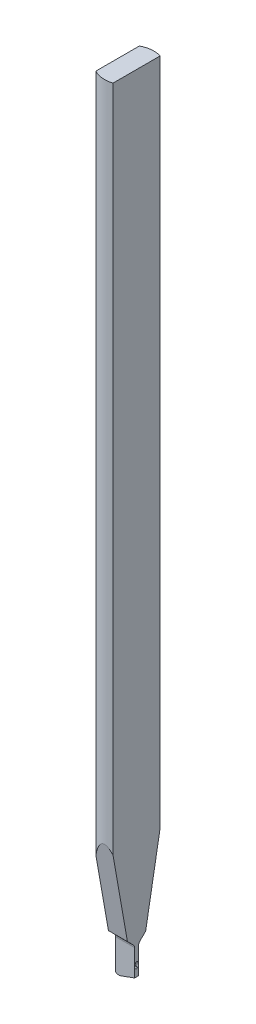
ISO-10303-21;
HEADER;
FILE_DESCRIPTION(('STEP AP214'),'2;1');
FILE_NAME('part.step','',(''),(''),'','','');
FILE_SCHEMA(('AUTOMOTIVE_DESIGN { 1 0 10303 214 1 1 1 1 }'));
ENDSEC;
DATA;
#1=APPLICATION_CONTEXT('core data for automotive mechanical design processes');
#2=APPLICATION_PROTOCOL_DEFINITION('international standard','automotive_design',2000,#1);
#3=PRODUCT_CONTEXT('',#1,'mechanical');
#4=PRODUCT('Part','Part','',(#3));
#5=PRODUCT_RELATED_PRODUCT_CATEGORY('part','',(#4));
#6=PRODUCT_DEFINITION_FORMATION('','',#4);
#7=PRODUCT_DEFINITION_CONTEXT('part definition',#1,'design');
#8=PRODUCT_DEFINITION('design','',#6,#7);
#9=PRODUCT_DEFINITION_SHAPE('','',#8);
#10=(LENGTH_UNIT() NAMED_UNIT(*) SI_UNIT(.MILLI.,.METRE.));
#11=(NAMED_UNIT(*) PLANE_ANGLE_UNIT() SI_UNIT($,.RADIAN.));
#12=(NAMED_UNIT(*) SI_UNIT($,.STERADIAN.) SOLID_ANGLE_UNIT());
#13=UNCERTAINTY_MEASURE_WITH_UNIT(LENGTH_MEASURE(1.E-05),#10,'distance_accuracy_value','');
#14=(GEOMETRIC_REPRESENTATION_CONTEXT(3) GLOBAL_UNCERTAINTY_ASSIGNED_CONTEXT((#13)) GLOBAL_UNIT_ASSIGNED_CONTEXT((#10,
#11,#12)) REPRESENTATION_CONTEXT('',''));
#15=CARTESIAN_POINT('',(0.,0.,0.));
#16=DIRECTION('',(0.,0.,1.));
#17=DIRECTION('',(1.,0.,0.));
#18=AXIS2_PLACEMENT_3D('',#15,#16,#17);
#19=CARTESIAN_POINT('',(32.315162028911,0.,-0.0635));
#20=DIRECTION('',(0.,0.,-1.));
#21=DIRECTION('',(-1.,0.,0.));
#22=AXIS2_PLACEMENT_3D('',#19,#20,#21);
#23=PLANE('',#22);
#24=DIRECTION('',(0.,1.,0.));
#25=VECTOR('',#24,1.);
#26=CARTESIAN_POINT('',(0.23368,0.,-0.0635));
#27=LINE('',#26,#25);
#28=CARTESIAN_POINT('',(0.23368,0.501535129884217,-0.0635));
#29=VERTEX_POINT('',#28);
#30=CARTESIAN_POINT('',(0.23368,1.016,-0.0635000000000001));
#31=VERTEX_POINT('',#30);
#32=EDGE_CURVE('E315',#29,#31,#27,.T.);
#33=ORIENTED_EDGE('',*,*,#32,.F.);
#34=CARTESIAN_POINT('',(0.23368,0.501535129884217,-0.0635));
#35=CARTESIAN_POINT('',(0.232967583186458,0.492128538234571,-0.0635));
#36=CARTESIAN_POINT('',(0.233679999999944,0.484736965625008,-0.0635));
#37=B_SPLINE_CURVE_WITH_KNOTS('',2,(#34,#35,#36),.UNSPECIFIED.,.F.,.F.,(3,3),(0.,1.),.UNSPECIFIED.);
#38=CARTESIAN_POINT('',(0.233679999999979,0.484736965625079,-0.0635));
#39=VERTEX_POINT('',#38);
#40=EDGE_CURVE('E60',#29,#39,#37,.T.);
#41=ORIENTED_EDGE('',*,*,#40,.T.);
#42=CARTESIAN_POINT('',(0.23368,0.171029613081689,-0.0635));
#43=VERTEX_POINT('',#42);
#44=EDGE_CURVE('E47',#43,#39,#27,.T.);
#45=ORIENTED_EDGE('',*,*,#44,.F.);
#46=DIRECTION('',(0.939692620785908,0.34202014332567,0.));
#47=VECTOR('',#46,1.);
#48=CARTESIAN_POINT('',(28.5073736740006,10.4618125231786,-0.0635));
#49=LINE('',#48,#47);
#50=CARTESIAN_POINT('',(-0.236219999999999,0.,-0.0635));
#51=VERTEX_POINT('',#50);
#52=EDGE_CURVE('E332',#51,#43,#49,.T.);
#53=ORIENTED_EDGE('',*,*,#52,.F.);
#54=DIRECTION('',(-1.,0.,0.));
#55=VECTOR('',#54,1.);
#56=CARTESIAN_POINT('',(32.315162028911,0.,-0.0635));
#57=LINE('',#56,#55);
#58=CARTESIAN_POINT('',(-0.32004,0.,-0.0635000000000011));
#59=VERTEX_POINT('',#58);
#60=EDGE_CURVE('E353',#51,#59,#57,.T.);
#61=ORIENTED_EDGE('',*,*,#60,.T.);
#62=CARTESIAN_POINT('',(-0.32004,0.05588,-0.0635000000000011));
#63=DIRECTION('',(0.,0.,-1.));
#64=DIRECTION('',(-1.,0.,0.));
#65=AXIS2_PLACEMENT_3D('',#62,#63,#64);
#66=CIRCLE('',#65,0.05588);
#67=CARTESIAN_POINT('',(-0.37592,0.05588,-0.0635000000000011));
#68=VERTEX_POINT('',#67);
#69=EDGE_CURVE('E472',#68,#59,#66,.F.);
#70=ORIENTED_EDGE('',*,*,#69,.F.);
#71=DIRECTION('',(0.,-1.,0.));
#72=VECTOR('',#71,1.);
#73=CARTESIAN_POINT('',(-0.37592,25.4,-0.0635));
#74=LINE('',#73,#72);
#75=CARTESIAN_POINT('',(-0.375920000000002,1.016,-0.0635000000000001));
#76=VERTEX_POINT('',#75);
#77=EDGE_CURVE('E389',#76,#68,#74,.T.);
#78=ORIENTED_EDGE('',*,*,#77,.F.);
#79=DIRECTION('',(-1.,0.,0.));
#80=VECTOR('',#79,1.);
#81=CARTESIAN_POINT('',(32.315162028911,1.016,-0.0635000000000001));
#82=LINE('',#81,#80);
#83=EDGE_CURVE('E340',#31,#76,#82,.T.);
#84=ORIENTED_EDGE('',*,*,#83,.F.);
#85=EDGE_LOOP('',(#33,#41,#45,#53,#61,#70,#78,#84));
#86=FACE_BOUND('',#85,.T.);
#87=ADVANCED_FACE('F43',(#86),#23,.T.);
#88=CARTESIAN_POINT('',(32.315162028911,0.,0.0635));
#89=DIRECTION('',(0.,0.,1.));
#90=DIRECTION('',(1.,0.,0.));
#91=AXIS2_PLACEMENT_3D('',#88,#89,#90);
#92=PLANE('',#91);
#93=DIRECTION('',(0.,-1.,0.));
#94=VECTOR('',#93,1.);
#95=CARTESIAN_POINT('',(0.23368,0.,0.0635));
#96=LINE('',#95,#94);
#97=CARTESIAN_POINT('',(0.233679999999121,0.484736965627162,0.0635));
#98=VERTEX_POINT('',#97);
#99=CARTESIAN_POINT('',(0.23368,0.171029613081689,0.0635));
#100=VERTEX_POINT('',#99);
#101=EDGE_CURVE('E443',#98,#100,#96,.T.);
#102=ORIENTED_EDGE('',*,*,#101,.F.);
#103=CARTESIAN_POINT('',(0.23368,0.48473696562502,0.0635));
#104=CARTESIAN_POINT('',(0.232967583185736,0.492128538242582,0.0635));
#105=CARTESIAN_POINT('',(0.233679999998765,0.50153512988423,0.0635));
#106=B_SPLINE_CURVE_WITH_KNOTS('',2,(#103,#104,#105),.UNSPECIFIED.,.F.,.F.,(3,3),(0.,1.),.UNSPECIFIED.);
#107=CARTESIAN_POINT('',(0.23368,0.501535129884217,0.0635));
#108=VERTEX_POINT('',#107);
#109=EDGE_CURVE('E504',#98,#108,#106,.T.);
#110=ORIENTED_EDGE('',*,*,#109,.T.);
#111=CARTESIAN_POINT('',(0.23368,1.016,0.0635));
#112=VERTEX_POINT('',#111);
#113=EDGE_CURVE('E484',#112,#108,#96,.T.);
#114=ORIENTED_EDGE('',*,*,#113,.F.);
#115=DIRECTION('',(-1.,0.,0.));
#116=VECTOR('',#115,1.);
#117=CARTESIAN_POINT('',(32.315162028911,1.016,0.0635));
#118=LINE('',#117,#116);
#119=CARTESIAN_POINT('',(-0.375920000000002,1.016,0.0635));
#120=VERTEX_POINT('',#119);
#121=EDGE_CURVE('E337',#112,#120,#118,.T.);
#122=ORIENTED_EDGE('',*,*,#121,.T.);
#123=DIRECTION('',(0.,1.,0.));
#124=VECTOR('',#123,1.);
#125=CARTESIAN_POINT('',(-0.37592,25.4,0.0635));
#126=LINE('',#125,#124);
#127=CARTESIAN_POINT('',(-0.37592,0.05588,0.0635000000000011));
#128=VERTEX_POINT('',#127);
#129=EDGE_CURVE('E387',#128,#120,#126,.T.);
#130=ORIENTED_EDGE('',*,*,#129,.F.);
#131=CARTESIAN_POINT('',(-0.32004,0.05588,0.0635000000000011));
#132=DIRECTION('',(0.,0.,1.));
#133=DIRECTION('',(1.,0.,0.));
#134=AXIS2_PLACEMENT_3D('',#131,#132,#133);
#135=CIRCLE('',#134,0.05588);
#136=CARTESIAN_POINT('',(-0.32004,0.,0.0635000000000011));
#137=VERTEX_POINT('',#136);
#138=EDGE_CURVE('E401',#137,#128,#135,.F.);
#139=ORIENTED_EDGE('',*,*,#138,.F.);
#140=DIRECTION('',(-1.,0.,0.));
#141=VECTOR('',#140,1.);
#142=CARTESIAN_POINT('',(32.315162028911,0.,0.0635));
#143=LINE('',#142,#141);
#144=CARTESIAN_POINT('',(-0.236219999999999,0.,0.0635));
#145=VERTEX_POINT('',#144);
#146=EDGE_CURVE('E350',#145,#137,#143,.T.);
#147=ORIENTED_EDGE('',*,*,#146,.F.);
#148=DIRECTION('',(-0.939692620785908,-0.34202014332567,0.));
#149=VECTOR('',#148,1.);
#150=CARTESIAN_POINT('',(28.5073736740006,10.4618125231786,0.0635));
#151=LINE('',#150,#149);
#152=EDGE_CURVE('E398',#100,#145,#151,.T.);
#153=ORIENTED_EDGE('',*,*,#152,.F.);
#154=EDGE_LOOP('',(#102,#110,#114,#122,#130,#139,#147,#153));
#155=FACE_BOUND('',#154,.T.);
#156=ADVANCED_FACE('F294',(#155),#92,.T.);
#157=CARTESIAN_POINT('',(0.23368,0.171029613081689,32.2105877496355));
#158=DIRECTION('',(-1.,0.,0.));
#159=DIRECTION('',(0.,-1.,0.));
#160=AXIS2_PLACEMENT_3D('',#157,#158,#159);
#161=PLANE('',#160);
#162=CARTESIAN_POINT('',(0.23368,0.493136047754618,0.));
#163=DIRECTION('',(-1.,0.,0.));
#164=DIRECTION('',(0.,1.,0.));
#165=AXIS2_PLACEMENT_3D('',#162,#163,#164);
#166=ELLIPSE('',#165,0.0990214987641499,0.0637296675187045);
#167=EDGE_CURVE('E11',#98,#39,#166,.F.);
#168=ORIENTED_EDGE('',*,*,#167,.F.);
#169=ORIENTED_EDGE('',*,*,#101,.T.);
#170=DIRECTION('',(0.,0.,-1.));
#171=VECTOR('',#170,1.);
#172=CARTESIAN_POINT('',(0.23368,0.171029613081689,32.2105877496355));
#173=LINE('',#172,#171);
#174=EDGE_CURVE('E468',#100,#43,#173,.T.);
#175=ORIENTED_EDGE('',*,*,#174,.T.);
#176=ORIENTED_EDGE('',*,*,#44,.T.);
#177=EDGE_LOOP('',(#168,#169,#175,#176));
#178=FACE_BOUND('',#177,.T.);
#179=ADVANCED_FACE('F300',(#178),#161,.F.);
#180=CARTESIAN_POINT('',(0.,0.,0.));
#181=DIRECTION('',(0.,1.,0.));
#182=DIRECTION('',(0.,0.,1.));
#183=AXIS2_PLACEMENT_3D('',#180,#181,#182);
#184=PLANE('',#183);
#185=DIRECTION('',(1.,0.,0.));
#186=VECTOR('',#185,1.);
#187=CARTESIAN_POINT('',(-0.375920000000002,0.,0.0254));
#188=LINE('',#187,#186);
#189=CARTESIAN_POINT('',(-0.32004,0.,0.0253999999999969));
#190=VERTEX_POINT('',#189);
#191=CARTESIAN_POINT('',(-0.24787716848564,0.,0.0254));
#192=VERTEX_POINT('',#191);
#193=EDGE_CURVE('E522',#190,#192,#188,.T.);
#194=ORIENTED_EDGE('',*,*,#193,.T.);
#195=CARTESIAN_POINT('',(-0.21508590948775,0.,0.));
#196=DIRECTION('',(0.,1.,0.));
#197=DIRECTION('',(-1.,0.,0.));
#198=AXIS2_PLACEMENT_3D('',#195,#196,#197);
#199=ELLIPSE('',#198,0.0439940905122496,0.0381);
#200=CARTESIAN_POINT('',(-0.23622,0.,0.0334159043520466));
#201=VERTEX_POINT('',#200);
#202=EDGE_CURVE('E257',#201,#192,#199,.F.);
#203=ORIENTED_EDGE('',*,*,#202,.F.);
#204=DIRECTION('',(0.,0.,-1.));
#205=VECTOR('',#204,1.);
#206=CARTESIAN_POINT('',(-0.23622,0.,32.2105877496355));
#207=LINE('',#206,#205);
#208=EDGE_CURVE('E444',#145,#201,#207,.T.);
#209=ORIENTED_EDGE('',*,*,#208,.F.);
#210=ORIENTED_EDGE('',*,*,#146,.T.);
#211=DIRECTION('',(0.,0.,-1.));
#212=VECTOR('',#211,1.);
#213=CARTESIAN_POINT('',(-0.32004,0.,31.9002533260299));
#214=LINE('',#213,#212);
#215=EDGE_CURVE('E515',#137,#190,#214,.T.);
#216=ORIENTED_EDGE('',*,*,#215,.T.);
#217=EDGE_LOOP('',(#194,#203,#209,#210,#216));
#218=FACE_BOUND('',#217,.T.);
#219=ADVANCED_FACE('F520',(#218),#184,.F.);
#220=CARTESIAN_POINT('',(-0.23622,0.,-0.0334159043520466));
#221=VERTEX_POINT('',#220);
#222=EDGE_CURVE('E467',#221,#51,#207,.T.);
#223=ORIENTED_EDGE('',*,*,#222,.F.);
#224=CARTESIAN_POINT('',(-0.24787716848564,0.,-0.0254));
#225=VERTEX_POINT('',#224);
#226=EDGE_CURVE('E255',#225,#221,#199,.F.);
#227=ORIENTED_EDGE('',*,*,#226,.F.);
#228=DIRECTION('',(1.,0.,0.));
#229=VECTOR('',#228,1.);
#230=CARTESIAN_POINT('',(-0.375920000000002,0.,-0.0254));
#231=LINE('',#230,#229);
#232=CARTESIAN_POINT('',(-0.32004,0.,-0.0254000000000038));
#233=VERTEX_POINT('',#232);
#234=EDGE_CURVE('E529',#233,#225,#231,.T.);
#235=ORIENTED_EDGE('',*,*,#234,.F.);
#236=EDGE_CURVE('E524',#233,#59,#214,.T.);
#237=ORIENTED_EDGE('',*,*,#236,.T.);
#238=ORIENTED_EDGE('',*,*,#60,.F.);
#239=EDGE_LOOP('',(#223,#227,#235,#237,#238));
#240=FACE_BOUND('',#239,.T.);
#241=ADVANCED_FACE('F551',(#240),#184,.F.);
#242=CARTESIAN_POINT('',(0.,25.4,0.));
#243=DIRECTION('',(0.,-1.,0.));
#244=DIRECTION('',(0.,0.,-1.));
#245=AXIS2_PLACEMENT_3D('',#242,#243,#244);
#246=CYLINDRICAL_SURFACE('',#245,0.792479999999998);
#247=CARTESIAN_POINT('',(0.,25.4,0.));
#248=DIRECTION('',(0.,1.,0.));
#249=DIRECTION('',(0.,0.,1.));
#250=AXIS2_PLACEMENT_3D('',#247,#248,#249);
#251=CIRCLE('',#250,0.792479999999998);
#252=CARTESIAN_POINT('',(0.233679999999999,25.4,-0.757243823348859));
#253=VERTEX_POINT('',#252);
#254=CARTESIAN_POINT('',(-0.37592,25.4,-0.69764511322018));
#255=VERTEX_POINT('',#254);
#256=EDGE_CURVE('E369',#253,#255,#251,.T.);
#257=ORIENTED_EDGE('',*,*,#256,.F.);
#258=DIRECTION('',(0.,-1.,0.));
#259=VECTOR('',#258,1.);
#260=CARTESIAN_POINT('',(0.233679999999999,25.4,-0.757243823348859));
#261=LINE('',#260,#259);
#262=CARTESIAN_POINT('',(0.23368,3.93441673283044,-0.757243823348858));
#263=VERTEX_POINT('',#262);
#264=EDGE_CURVE('E330',#253,#263,#261,.T.);
#265=ORIENTED_EDGE('',*,*,#264,.T.);
#266=CARTESIAN_POINT('',(0.,-0.360126395545723,0.));
#267=DIRECTION('',(0.,-0.173648177666931,-0.984807753012208));
#268=DIRECTION('',(0.,-0.984807753012208,0.173648177666931));
#269=AXIS2_PLACEMENT_3D('',#266,#267,#268);
#270=ELLIPSE('',#269,4.56371043248163,0.792479999999998);
#271=CARTESIAN_POINT('',(-0.37592,3.596415651605,-0.69764511322018));
#272=VERTEX_POINT('',#271);
#273=EDGE_CURVE('E358',#272,#263,#270,.T.);
#274=ORIENTED_EDGE('',*,*,#273,.F.);
#275=DIRECTION('',(0.,-1.,0.));
#276=VECTOR('',#275,1.);
#277=CARTESIAN_POINT('',(-0.37592,25.4,-0.69764511322018));
#278=LINE('',#277,#276);
#279=EDGE_CURVE('E366',#255,#272,#278,.T.);
#280=ORIENTED_EDGE('',*,*,#279,.F.);
#281=EDGE_LOOP('',(#257,#265,#274,#280));
#282=FACE_BOUND('',#281,.T.);
#283=ADVANCED_FACE('F583',(#282),#246,.T.);
#284=CARTESIAN_POINT('',(0.,25.4,0.));
#285=DIRECTION('',(0.,1.,0.));
#286=DIRECTION('',(0.,0.,1.));
#287=AXIS2_PLACEMENT_3D('',#284,#285,#286);
#288=PLANE('',#287);
#289=CARTESIAN_POINT('',(-0.37592,25.4,0.69764511322018));
#290=VERTEX_POINT('',#289);
#291=CARTESIAN_POINT('',(0.233679999999999,25.4,0.757243823348859));
#292=VERTEX_POINT('',#291);
#293=EDGE_CURVE('E370',#290,#292,#251,.T.);
#294=ORIENTED_EDGE('',*,*,#293,.T.);
#295=DIRECTION('',(0.,0.,-1.));
#296=VECTOR('',#295,1.);
#297=CARTESIAN_POINT('',(0.233679999999999,25.4,32.2105877496355));
#298=LINE('',#297,#296);
#299=EDGE_CURVE('E464',#292,#253,#298,.T.);
#300=ORIENTED_EDGE('',*,*,#299,.T.);
#301=ORIENTED_EDGE('',*,*,#256,.T.);
#302=DIRECTION('',(0.,0.,-1.));
#303=VECTOR('',#302,1.);
#304=CARTESIAN_POINT('',(-0.37592,25.4,-1.04648));
#305=LINE('',#304,#303);
#306=EDGE_CURVE('E361',#290,#255,#305,.T.);
#307=ORIENTED_EDGE('',*,*,#306,.F.);
#308=EDGE_LOOP('',(#294,#300,#301,#307));
#309=FACE_BOUND('',#308,.T.);
#310=ADVANCED_FACE('F463',(#309),#288,.T.);
#311=CARTESIAN_POINT('',(0.,-0.360126395545723,0.));
#312=DIRECTION('',(0.,-0.173648177666931,0.984807753012208));
#313=DIRECTION('',(0.,-0.984807753012208,-0.173648177666931));
#314=AXIS2_PLACEMENT_3D('',#311,#312,#313);
#315=ELLIPSE('',#314,4.56371043248163,0.792479999999998);
#316=CARTESIAN_POINT('',(0.23368,3.93441673283044,0.757243823348858));
#317=VERTEX_POINT('',#316);
#318=CARTESIAN_POINT('',(-0.37592,3.596415651605,0.69764511322018));
#319=VERTEX_POINT('',#318);
#320=EDGE_CURVE('E356',#317,#319,#315,.T.);
#321=ORIENTED_EDGE('',*,*,#320,.F.);
#322=DIRECTION('',(0.,-1.,0.));
#323=VECTOR('',#322,1.);
#324=CARTESIAN_POINT('',(0.233679999999999,25.4,0.757243823348859));
#325=LINE('',#324,#323);
#326=EDGE_CURVE('E460',#317,#292,#325,.F.);
#327=ORIENTED_EDGE('',*,*,#326,.T.);
#328=ORIENTED_EDGE('',*,*,#293,.F.);
#329=DIRECTION('',(0.,-1.,0.));
#330=VECTOR('',#329,1.);
#331=CARTESIAN_POINT('',(-0.37592,25.4,0.69764511322018));
#332=LINE('',#331,#330);
#333=EDGE_CURVE('E364',#319,#290,#332,.F.);
#334=ORIENTED_EDGE('',*,*,#333,.F.);
#335=EDGE_LOOP('',(#321,#327,#328,#334));
#336=FACE_BOUND('',#335,.T.);
#337=ADVANCED_FACE('F45',(#336),#246,.T.);
#338=CARTESIAN_POINT('',(-0.37592,25.4,-1.04648));
#339=DIRECTION('',(-1.,0.,0.));
#340=DIRECTION('',(0.,0.,1.));
#341=AXIS2_PLACEMENT_3D('',#338,#339,#340);
#342=PLANE('',#341);
#343=DIRECTION('',(0.,0.,-1.));
#344=VECTOR('',#343,1.);
#345=CARTESIAN_POINT('',(-0.37592,0.05588,31.9002533260299));
#346=LINE('',#345,#344);
#347=EDGE_CURVE('E527',#128,#68,#346,.T.);
#348=ORIENTED_EDGE('',*,*,#347,.F.);
#349=ORIENTED_EDGE('',*,*,#129,.T.);
#350=CARTESIAN_POINT('',(-0.375920000000002,1.016,0.1905));
#351=DIRECTION('',(-1.,0.,0.));
#352=DIRECTION('',(0.,0.,1.));
#353=AXIS2_PLACEMENT_3D('',#350,#351,#352);
#354=CIRCLE('',#353,0.127);
#355=CARTESIAN_POINT('',(-0.375920000000002,1.10580256121069,0.100697438789309));
#356=VERTEX_POINT('',#355);
#357=EDGE_CURVE('E384',#120,#356,#354,.F.);
#358=ORIENTED_EDGE('',*,*,#357,.T.);
#359=DIRECTION('',(0.,0.707106781186546,0.707106781186549));
#360=VECTOR('',#359,1.);
#361=CARTESIAN_POINT('',(-0.37592,12.6793125612106,11.6742074387893));
#362=LINE('',#361,#360);
#363=CARTESIAN_POINT('',(-0.375920000000002,1.29736569900095,0.292260576579566));
#364=VERTEX_POINT('',#363);
#365=EDGE_CURVE('E347',#356,#364,#362,.T.);
#366=ORIENTED_EDGE('',*,*,#365,.T.);
#367=DIRECTION('',(0.,0.984807753012208,0.173648177666931));
#368=VECTOR('',#367,1.);
#369=CARTESIAN_POINT('',(-0.37592,24.4442785246367,4.37368582784599));
#370=LINE('',#369,#368);
#371=EDGE_CURVE('E373',#364,#319,#370,.T.);
#372=ORIENTED_EDGE('',*,*,#371,.T.);
#373=ORIENTED_EDGE('',*,*,#333,.T.);
#374=ORIENTED_EDGE('',*,*,#306,.T.);
#375=ORIENTED_EDGE('',*,*,#279,.T.);
#376=DIRECTION('',(0.,-0.984807753012208,0.173648177666931));
#377=VECTOR('',#376,1.);
#378=CARTESIAN_POINT('',(-0.37592,24.8021957642242,-4.43679629404595));
#379=LINE('',#378,#377);
#380=CARTESIAN_POINT('',(-0.37592,1.29736569900094,-0.292260576579564));
#381=VERTEX_POINT('',#380);
#382=EDGE_CURVE('E376',#272,#381,#379,.T.);
#383=ORIENTED_EDGE('',*,*,#382,.T.);
#384=DIRECTION('',(0.,-0.707106781186546,0.707106781186549));
#385=VECTOR('',#384,1.);
#386=CARTESIAN_POINT('',(-0.37592,13.7257925612106,-12.7206874387893));
#387=LINE('',#386,#385);
#388=CARTESIAN_POINT('',(-0.375920000000002,1.10580256121069,-0.100697438789309));
#389=VERTEX_POINT('',#388);
#390=EDGE_CURVE('E344',#381,#389,#387,.T.);
#391=ORIENTED_EDGE('',*,*,#390,.T.);
#392=CARTESIAN_POINT('',(-0.375920000000002,1.016,-0.1905));
#393=DIRECTION('',(-1.,0.,0.));
#394=DIRECTION('',(0.,0.,1.));
#395=AXIS2_PLACEMENT_3D('',#392,#393,#394);
#396=CIRCLE('',#395,0.127);
#397=EDGE_CURVE('E392',#389,#76,#396,.F.);
#398=ORIENTED_EDGE('',*,*,#397,.T.);
#399=ORIENTED_EDGE('',*,*,#77,.T.);
#400=EDGE_LOOP('',(#348,#349,#358,#366,#372,#373,#374,#375,#383,#391,#398,#399));
#401=FACE_BOUND('',#400,.T.);
#402=ADVANCED_FACE('F456',(#401),#342,.T.);
#403=CARTESIAN_POINT('',(32.315162028911,0.,0.0635));
#404=DIRECTION('',(0.,-0.173648177666931,0.984807753012208));
#405=DIRECTION('',(0.,-0.984807753012208,-0.173648177666931));
#406=AXIS2_PLACEMENT_3D('',#403,#404,#405);
#407=PLANE('',#406);
#408=DIRECTION('',(0.,-0.984807753012208,-0.173648177666931));
#409=VECTOR('',#408,1.);
#410=CARTESIAN_POINT('',(0.23368,0.,0.0634999999999999));
#411=LINE('',#410,#409);
#412=CARTESIAN_POINT('',(0.23368,1.29736569900095,0.292260576579566));
#413=VERTEX_POINT('',#412);
#414=EDGE_CURVE('E448',#317,#413,#411,.T.);
#415=ORIENTED_EDGE('',*,*,#414,.F.);
#416=ORIENTED_EDGE('',*,*,#320,.T.);
#417=ORIENTED_EDGE('',*,*,#371,.F.);
#418=DIRECTION('',(1.,0.,0.));
#419=VECTOR('',#418,1.);
#420=CARTESIAN_POINT('',(32.315162028911,1.29736569900095,0.292260576579566));
#421=LINE('',#420,#419);
#422=EDGE_CURVE('E381',#364,#413,#421,.T.);
#423=ORIENTED_EDGE('',*,*,#422,.T.);
#424=EDGE_LOOP('',(#415,#416,#417,#423));
#425=FACE_BOUND('',#424,.T.);
#426=ADVANCED_FACE('F451',(#425),#407,.T.);
#427=CARTESIAN_POINT('',(32.315162028911,0.,-0.0635));
#428=DIRECTION('',(0.,-0.173648177666931,-0.984807753012208));
#429=DIRECTION('',(0.,0.984807753012208,-0.173648177666931));
#430=AXIS2_PLACEMENT_3D('',#427,#428,#429);
#431=PLANE('',#430);
#432=DIRECTION('',(0.,0.984807753012208,-0.173648177666931));
#433=VECTOR('',#432,1.);
#434=CARTESIAN_POINT('',(0.23368,0.,-0.0634999999999999));
#435=LINE('',#434,#433);
#436=CARTESIAN_POINT('',(0.23368,1.29736569900095,-0.292260576579566));
#437=VERTEX_POINT('',#436);
#438=EDGE_CURVE('E326',#437,#263,#435,.T.);
#439=ORIENTED_EDGE('',*,*,#438,.F.);
#440=DIRECTION('',(-1.,0.,0.));
#441=VECTOR('',#440,1.);
#442=CARTESIAN_POINT('',(32.315162028911,1.29736569900095,-0.292260576579566));
#443=LINE('',#442,#441);
#444=EDGE_CURVE('E379',#437,#381,#443,.T.);
#445=ORIENTED_EDGE('',*,*,#444,.T.);
#446=ORIENTED_EDGE('',*,*,#382,.F.);
#447=ORIENTED_EDGE('',*,*,#273,.T.);
#448=EDGE_LOOP('',(#439,#445,#446,#447));
#449=FACE_BOUND('',#448,.T.);
#450=ADVANCED_FACE('F579',(#449),#431,.T.);
#451=CARTESIAN_POINT('',(32.315162028911,1.10580256121069,-0.100697438789309));
#452=DIRECTION('',(0.,-0.707106781186549,-0.707106781186546));
#453=DIRECTION('',(0.,0.707106781186546,-0.707106781186549));
#454=AXIS2_PLACEMENT_3D('',#451,#452,#453);
#455=PLANE('',#454);
#456=DIRECTION('',(0.,0.707106781186546,-0.707106781186549));
#457=VECTOR('',#456,1.);
#458=CARTESIAN_POINT('',(0.23368,1.10580256121069,-0.100697438789308));
#459=LINE('',#458,#457);
#460=CARTESIAN_POINT('',(0.23368,1.10580256121069,-0.100697438789309));
#461=VERTEX_POINT('',#460);
#462=EDGE_CURVE('E321',#461,#437,#459,.T.);
#463=ORIENTED_EDGE('',*,*,#462,.F.);
#464=DIRECTION('',(-1.,0.,0.));
#465=VECTOR('',#464,1.);
#466=CARTESIAN_POINT('',(32.315162028911,1.10580256121069,-0.100697438789309));
#467=LINE('',#466,#465);
#468=EDGE_CURVE('E342',#461,#389,#467,.T.);
#469=ORIENTED_EDGE('',*,*,#468,.T.);
#470=ORIENTED_EDGE('',*,*,#390,.F.);
#471=ORIENTED_EDGE('',*,*,#444,.F.);
#472=EDGE_LOOP('',(#463,#469,#470,#471));
#473=FACE_BOUND('',#472,.T.);
#474=ADVANCED_FACE('F434',(#473),#455,.T.);
#475=CARTESIAN_POINT('',(32.315162028911,1.016,-0.1905));
#476=DIRECTION('',(-1.,0.,0.));
#477=DIRECTION('',(0.,0.,1.));
#478=AXIS2_PLACEMENT_3D('',#475,#476,#477);
#479=CYLINDRICAL_SURFACE('',#478,0.127);
#480=CARTESIAN_POINT('',(0.23368,1.016,-0.1905));
#481=DIRECTION('',(-1.,0.,0.));
#482=DIRECTION('',(0.,-1.,0.));
#483=AXIS2_PLACEMENT_3D('',#480,#481,#482);
#484=CIRCLE('',#483,0.127);
#485=EDGE_CURVE('E574',#31,#461,#484,.T.);
#486=ORIENTED_EDGE('',*,*,#485,.F.);
#487=ORIENTED_EDGE('',*,*,#83,.T.);
#488=ORIENTED_EDGE('',*,*,#397,.F.);
#489=ORIENTED_EDGE('',*,*,#468,.F.);
#490=EDGE_LOOP('',(#486,#487,#488,#489));
#491=FACE_BOUND('',#490,.T.);
#492=ADVANCED_FACE('F308',(#491),#479,.F.);
#493=CARTESIAN_POINT('',(32.315162028911,1.016,0.1905));
#494=DIRECTION('',(-1.,0.,0.));
#495=DIRECTION('',(0.,0.,1.));
#496=AXIS2_PLACEMENT_3D('',#493,#494,#495);
#497=CYLINDRICAL_SURFACE('',#496,0.127);
#498=CARTESIAN_POINT('',(0.23368,1.016,0.1905));
#499=DIRECTION('',(-1.,0.,0.));
#500=DIRECTION('',(0.,-1.,0.));
#501=AXIS2_PLACEMENT_3D('',#498,#499,#500);
#502=CIRCLE('',#501,0.127);
#503=CARTESIAN_POINT('',(0.23368,1.10580256121069,0.100697438789309));
#504=VERTEX_POINT('',#503);
#505=EDGE_CURVE('E439',#504,#112,#502,.T.);
#506=ORIENTED_EDGE('',*,*,#505,.F.);
#507=DIRECTION('',(-1.,0.,0.));
#508=VECTOR('',#507,1.);
#509=CARTESIAN_POINT('',(32.315162028911,1.10580256121069,0.100697438789309));
#510=LINE('',#509,#508);
#511=EDGE_CURVE('E335',#504,#356,#510,.T.);
#512=ORIENTED_EDGE('',*,*,#511,.T.);
#513=ORIENTED_EDGE('',*,*,#357,.F.);
#514=ORIENTED_EDGE('',*,*,#121,.F.);
#515=EDGE_LOOP('',(#506,#512,#513,#514));
#516=FACE_BOUND('',#515,.T.);
#517=ADVANCED_FACE('F427',(#516),#497,.F.);
#518=CARTESIAN_POINT('',(32.315162028911,1.10580256121069,0.100697438789309));
#519=DIRECTION('',(0.,-0.707106781186549,0.707106781186546));
#520=DIRECTION('',(0.,-0.707106781186546,-0.707106781186549));
#521=AXIS2_PLACEMENT_3D('',#518,#519,#520);
#522=PLANE('',#521);
#523=DIRECTION('',(0.,-0.707106781186546,-0.707106781186549));
#524=VECTOR('',#523,1.);
#525=CARTESIAN_POINT('',(0.23368,1.10580256121069,0.100697438789308));
#526=LINE('',#525,#524);
#527=EDGE_CURVE('E395',#413,#504,#526,.T.);
#528=ORIENTED_EDGE('',*,*,#527,.F.);
#529=ORIENTED_EDGE('',*,*,#422,.F.);
#530=ORIENTED_EDGE('',*,*,#365,.F.);
#531=ORIENTED_EDGE('',*,*,#511,.F.);
#532=EDGE_LOOP('',(#528,#529,#530,#531));
#533=FACE_BOUND('',#532,.T.);
#534=ADVANCED_FACE('F421',(#533),#522,.T.);
#535=EDGE_CURVE('E53',#29,#108,#166,.F.);
#536=ORIENTED_EDGE('',*,*,#535,.F.);
#537=ORIENTED_EDGE('',*,*,#32,.T.);
#538=ORIENTED_EDGE('',*,*,#485,.T.);
#539=ORIENTED_EDGE('',*,*,#462,.T.);
#540=ORIENTED_EDGE('',*,*,#438,.T.);
#541=ORIENTED_EDGE('',*,*,#264,.F.);
#542=ORIENTED_EDGE('',*,*,#299,.F.);
#543=ORIENTED_EDGE('',*,*,#326,.F.);
#544=ORIENTED_EDGE('',*,*,#414,.T.);
#545=ORIENTED_EDGE('',*,*,#527,.T.);
#546=ORIENTED_EDGE('',*,*,#505,.T.);
#547=ORIENTED_EDGE('',*,*,#113,.T.);
#548=EDGE_LOOP('',(#536,#537,#538,#539,#540,#541,#542,#543,#544,#545,#546,#547));
#549=FACE_BOUND('',#548,.T.);
#550=ADVANCED_FACE('F418',(#549),#161,.F.);
#551=CARTESIAN_POINT('',(-0.23622,0.,32.2105877496355));
#552=DIRECTION('',(-0.34202014332567,0.939692620785908,0.));
#553=DIRECTION('',(-0.939692620785908,-0.34202014332567,0.));
#554=AXIS2_PLACEMENT_3D('',#551,#552,#553);
#555=PLANE('',#554);
#556=ORIENTED_EDGE('',*,*,#208,.T.);
#557=CARTESIAN_POINT('',(-0.209463302146593,0.00973864158589462,0.));
#558=DIRECTION('',(-0.34202014332567,0.939692620785908,0.));
#559=DIRECTION('',(-0.939692620785908,-0.34202014332567,0.));
#560=AXIS2_PLACEMENT_3D('',#557,#558,#559);
#561=ELLIPSE('',#560,0.0592730778033821,0.0381);
#562=CARTESIAN_POINT('',(-0.209463302146593,0.00973864158589466,0.0380999999999996));
#563=VERTEX_POINT('',#562);
#564=EDGE_CURVE('E542',#201,#563,#561,.T.);
#565=ORIENTED_EDGE('',*,*,#564,.T.);
#566=DIRECTION('',(-0.939692620785908,-0.34202014332567,0.));
#567=VECTOR('',#566,1.);
#568=CARTESIAN_POINT('',(-0.23622,0.,0.0380999999999992));
#569=LINE('',#568,#567);
#570=CARTESIAN_POINT('',(-0.0457200000000001,0.0693363296277118,0.0380999999999996));
#571=VERTEX_POINT('',#570);
#572=EDGE_CURVE('E486',#571,#563,#569,.T.);
#573=ORIENTED_EDGE('',*,*,#572,.F.);
#574=DIRECTION('',(0.,0.,1.));
#575=VECTOR('',#574,1.);
#576=CARTESIAN_POINT('',(-0.0457200000000001,0.0693363296277117,32.2105877496355));
#577=LINE('',#576,#575);
#578=CARTESIAN_POINT('',(-0.0457200000000001,0.0693363296277118,-0.0380999999999996));
#579=VERTEX_POINT('',#578);
#580=EDGE_CURVE('E506',#579,#571,#577,.T.);
#581=ORIENTED_EDGE('',*,*,#580,.F.);
#582=DIRECTION('',(-0.939692620785908,-0.34202014332567,0.));
#583=VECTOR('',#582,1.);
#584=CARTESIAN_POINT('',(-0.23622,0.,-0.0380999999999992));
#585=LINE('',#584,#583);
#586=CARTESIAN_POINT('',(-0.209463302146593,0.0097386415858947,-0.0380999999999996));
#587=VERTEX_POINT('',#586);
#588=EDGE_CURVE('E220',#579,#587,#585,.T.);
#589=ORIENTED_EDGE('',*,*,#588,.T.);
#590=EDGE_CURVE('E489',#587,#221,#561,.T.);
#591=ORIENTED_EDGE('',*,*,#590,.T.);
#592=ORIENTED_EDGE('',*,*,#222,.T.);
#593=ORIENTED_EDGE('',*,*,#52,.T.);
#594=ORIENTED_EDGE('',*,*,#174,.F.);
#595=ORIENTED_EDGE('',*,*,#152,.T.);
#596=EDGE_LOOP('',(#556,#565,#573,#581,#589,#591,#592,#593,#594,#595));
#597=FACE_BOUND('',#596,.T.);
#598=ADVANCED_FACE('F289',(#597),#555,.F.);
#599=CARTESIAN_POINT('',(-0.32004,0.05588,31.9002533260299));
#600=DIRECTION('',(0.,0.,-1.));
#601=DIRECTION('',(-1.,0.,0.));
#602=AXIS2_PLACEMENT_3D('',#599,#600,#601);
#603=CYLINDRICAL_SURFACE('',#602,0.05588);
#604=CARTESIAN_POINT('',(-0.356477674367003,0.0135140905122495,-0.0175976362048998));
#605=CARTESIAN_POINT('',(-0.357376904480429,0.014285183702578,-0.0171534341812295));
#606=CARTESIAN_POINT('',(-0.358230956798375,0.0150716844925735,-0.0166307240525674));
#607=CARTESIAN_POINT('',(-0.359831358951498,0.0166317386558357,-0.0154137360035441));
#608=CARTESIAN_POINT('',(-0.360577085501932,0.0174051960873458,-0.0147185230734212));
#609=CARTESIAN_POINT('',(-0.361820165258227,0.0187625401140965,-0.0132774879923897));
#610=CARTESIAN_POINT('',(-0.362338199406546,0.019356549911165,-0.0125593583458686));
#611=CARTESIAN_POINT('',(-0.363268664201059,0.0204628270686732,-0.0110045616330548));
#612=CARTESIAN_POINT('',(-0.363681368248266,0.0209753047275703,-0.0101682103922115));
#613=CARTESIAN_POINT('',(-0.364397427656335,0.0218897784461368,-0.00838679036111317));
#614=CARTESIAN_POINT('',(-0.364700136661285,0.0222911182577069,-0.00744112066223241));
#615=CARTESIAN_POINT('',(-0.365188939094006,0.0229510080003233,-0.00547184429455359));
#616=CARTESIAN_POINT('',(-0.36537497511811,0.0232094876360648,-0.00444819953897178));
#617=CARTESIAN_POINT('',(-0.365617016357075,0.0235481441498642,-0.00245544642240648));
#618=CARTESIAN_POINT('',(-0.365683410143287,0.0236425375819324,-0.00148998532537641));
#619=CARTESIAN_POINT('',(-0.365718477016404,0.0236922303543137,0.000445937022448626));
#620=CARTESIAN_POINT('',(-0.365687200090857,0.0236476008461356,0.001416395461795));
#621=CARTESIAN_POINT('',(-0.365529848146696,0.0234259544927587,0.00330029743864325));
#622=CARTESIAN_POINT('',(-0.365407033139834,0.0232534914153485,0.00421455756607617));
#623=CARTESIAN_POINT('',(-0.365070995866995,0.0227912595553173,0.00599543091968617));
#624=CARTESIAN_POINT('',(-0.364857771125423,0.0225014875605601,0.00686204284042873));
#625=CARTESIAN_POINT('',(-0.364338129300942,0.0218148032561501,0.00854055190001651));
#626=CARTESIAN_POINT('',(-0.364030160539243,0.0214161204474461,0.00935123987843365));
#627=CARTESIAN_POINT('',(-0.363326225925753,0.0205360721958222,0.0108841065506175));
#628=CARTESIAN_POINT('',(-0.362930259371885,0.0200547060932323,0.0116062845381484));
#629=CARTESIAN_POINT('',(-0.362023972479575,0.018995838977666,0.0130023513458808));
#630=CARTESIAN_POINT('',(-0.361507371132423,0.0184138656995733,0.0136687478134871));
#631=CARTESIAN_POINT('',(-0.360389060494097,0.0172122449623864,0.0148858131893031));
#632=CARTESIAN_POINT('',(-0.359787265509873,0.016592559932719,0.0154363641693705));
#633=CARTESIAN_POINT('',(-0.358316867513414,0.0151510589954576,0.0165776295403988));
#634=CARTESIAN_POINT('',(-0.357422583341065,0.0143247329024897,0.0171302343644652));
#635=CARTESIAN_POINT('',(-0.356477674367768,0.0135140905123211,0.0175976362059765));
#636=B_SPLINE_CURVE_WITH_KNOTS('',3,(#604,#605,#606,#607,#608,#609,#610,#611,#612,#613,#614,
#615,#616,#617,#618,#619,#620,#621,#622,#623,#624,#625,#626,#627,#628,#629,#630,#631,#632,#633,
#634,#635),.UNSPECIFIED.,.F.,.F.,(4,2,2,2,2,2,2,2,2,2,2,2,2,2,2,4),(0.,0.00379999899087664,
0.00762106297348012,0.010806011876462,0.0139826076747904,0.0171775790252757,0.0203741210863205,
0.0232765697391288,0.026177533171838,0.0289798422844726,0.0317822281347288,0.0346332019685614,
0.0374841985493063,0.0405455123891615,0.0436099276612735,0.0476000736904468),.UNSPECIFIED.);
#637=CARTESIAN_POINT('',(-0.356477674367005,0.0135140905122495,-0.0175976362048998));
#638=VERTEX_POINT('',#637);
#639=CARTESIAN_POINT('',(-0.356477674367003,0.0135140905122495,0.0175976362048998));
#640=VERTEX_POINT('',#639);
#641=EDGE_CURVE('E407',#638,#640,#636,.T.);
#642=ORIENTED_EDGE('',*,*,#641,.T.);
#643=CARTESIAN_POINT('',(-0.32004,0.05588,-0.00686233304231926));
#644=DIRECTION('',(0.,0.499999999999998,0.86602540378444));
#645=DIRECTION('',(0.,0.86602540378444,-0.499999999999998));
#646=AXIS2_PLACEMENT_3D('',#643,#644,#645);
#647=ELLIPSE('',#646,0.0645246660846325,0.05588);
#648=EDGE_CURVE('E414',#640,#190,#647,.T.);
#649=ORIENTED_EDGE('',*,*,#648,.T.);
#650=ORIENTED_EDGE('',*,*,#215,.F.);
#651=ORIENTED_EDGE('',*,*,#138,.T.);
#652=ORIENTED_EDGE('',*,*,#347,.T.);
#653=ORIENTED_EDGE('',*,*,#69,.T.);
#654=ORIENTED_EDGE('',*,*,#236,.F.);
#655=CARTESIAN_POINT('',(-0.32004,0.05588,0.00686233304231232));
#656=DIRECTION('',(0.,0.499999999999998,-0.86602540378444));
#657=DIRECTION('',(0.,-0.86602540378444,-0.499999999999998));
#658=AXIS2_PLACEMENT_3D('',#655,#656,#657);
#659=ELLIPSE('',#658,0.0645246660846325,0.05588);
#660=EDGE_CURVE('E404',#233,#638,#659,.T.);
#661=ORIENTED_EDGE('',*,*,#660,.T.);
#662=EDGE_LOOP('',(#642,#649,#650,#651,#652,#653,#654,#661));
#663=FACE_BOUND('',#662,.T.);
#664=ADVANCED_FACE('F281',(#663),#603,.T.);
#665=CARTESIAN_POINT('',(-0.375920000000002,0.,0.0254));
#666=DIRECTION('',(0.,0.499999999999998,0.86602540378444));
#667=DIRECTION('',(0.,-0.86602540378444,0.499999999999998));
#668=AXIS2_PLACEMENT_3D('',#665,#666,#667);
#669=PLANE('',#668);
#670=DIRECTION('',(1.,0.,0.));
#671=VECTOR('',#670,1.);
#672=CARTESIAN_POINT('',(-0.375920000000002,0.0135140905122495,0.0175976362048998));
#673=LINE('',#672,#671);
#674=CARTESIAN_POINT('',(-0.246303766091918,0.013514090511837,0.017597636205138));
#675=VERTEX_POINT('',#674);
#676=EDGE_CURVE('E532',#640,#675,#673,.T.);
#677=ORIENTED_EDGE('',*,*,#676,.T.);
#678=CARTESIAN_POINT('',(-0.18968590948775,0.0439940905122497,0.));
#679=DIRECTION('',(0.,0.499999999999998,0.86602540378444));
#680=DIRECTION('',(-0.554700196225233,-0.720576692122891,0.416025147168919));
#681=AXIS2_PLACEMENT_3D('',#678,#679,#680);
#682=ELLIPSE('',#681,0.0879881810244995,0.0381);
#683=EDGE_CURVE('E265',#675,#192,#682,.T.);
#684=ORIENTED_EDGE('',*,*,#683,.T.);
#685=ORIENTED_EDGE('',*,*,#193,.F.);
#686=ORIENTED_EDGE('',*,*,#648,.F.);
#687=EDGE_LOOP('',(#677,#684,#685,#686));
#688=FACE_BOUND('',#687,.T.);
#689=ADVANCED_FACE('F279',(#688),#669,.F.);
#690=CARTESIAN_POINT('',(-0.375920000000002,0.00335409051224956,0.));
#691=DIRECTION('',(1.,0.,0.));
#692=DIRECTION('',(0.,0.,-1.));
#693=AXIS2_PLACEMENT_3D('',#690,#691,#692);
#694=CYLINDRICAL_SURFACE('',#693,0.02032);
#695=DIRECTION('',(1.,0.,0.));
#696=VECTOR('',#695,1.);
#697=CARTESIAN_POINT('',(-0.375920000000002,0.0135140905122495,-0.0175976362048998));
#698=LINE('',#697,#696);
#699=CARTESIAN_POINT('',(-0.246303766091823,0.0135140905122495,-0.0175976362048998));
#700=VERTEX_POINT('',#699);
#701=EDGE_CURVE('E534',#638,#700,#698,.T.);
#702=ORIENTED_EDGE('',*,*,#701,.T.);
#703=CARTESIAN_POINT('',(-0.246303766091823,0.0135140905122495,-0.0175976362048998));
#704=CARTESIAN_POINT('',(-0.24609019789227,0.0144400305134525,-0.0170648888113214));
#705=CARTESIAN_POINT('',(-0.245926018320623,0.0153292486061833,-0.0164524717356096));
#706=CARTESIAN_POINT('',(-0.245673788750918,0.0170037727844593,-0.015090788698178));
#707=CARTESIAN_POINT('',(-0.245585501265051,0.0177893964645279,-0.0143419585919797));
#708=CARTESIAN_POINT('',(-0.2454614190573,0.019231697390432,-0.012727154902474));
#709=CARTESIAN_POINT('',(-0.245425571281076,0.0198885043792228,-0.0118613006853603));
#710=CARTESIAN_POINT('',(-0.245383887824398,0.0210563666003219,-0.0100352437968069));
#711=CARTESIAN_POINT('',(-0.245378068349689,0.021567342989936,-0.00907499046462348));
#712=CARTESIAN_POINT('',(-0.245378799325917,0.0224453688209553,-0.00704900242970388));
#713=CARTESIAN_POINT('',(-0.245385807638859,0.022806503910111,-0.00598070081901989));
#714=CARTESIAN_POINT('',(-0.245399537257073,0.0233474018707641,-0.00379909460177225));
#715=CARTESIAN_POINT('',(-0.245406258538919,0.0235271499664218,-0.00268578633663459));
#716=CARTESIAN_POINT('',(-0.245412740738285,0.0237017050785637,-0.000426273074912246));
#717=CARTESIAN_POINT('',(-0.245412385634588,0.0236934290291388,0.000720171960588426));
#718=CARTESIAN_POINT('',(-0.245404735533222,0.0234845516831196,0.0029953244032182));
#719=CARTESIAN_POINT('',(-0.245397440708671,0.0232839551841546,0.00412403225210557));
#720=CARTESIAN_POINT('',(-0.245383664552057,0.0226962726268598,0.00633139438397766));
#721=CARTESIAN_POINT('',(-0.245377182946607,0.0223092494542574,0.00741006541104448));
#722=CARTESIAN_POINT('',(-0.245380016924591,0.0213593813930623,0.00948770807069159));
#723=CARTESIAN_POINT('',(-0.245389339395799,0.0207964599312366,0.0104866447545527));
#724=CARTESIAN_POINT('',(-0.245445314616565,0.0195127516133702,0.0123733717502294));
#725=CARTESIAN_POINT('',(-0.245491895813931,0.018792269264629,0.0132613713316833));
#726=CARTESIAN_POINT('',(-0.245648866291787,0.0172166172213964,0.0149002742614693));
#727=CARTESIAN_POINT('',(-0.245759118632835,0.016361739437945,0.0156514672972808));
#728=CARTESIAN_POINT('',(-0.245967818074452,0.0151439856421801,0.0165545749914788));
#729=CARTESIAN_POINT('',(-0.246026822229853,0.014825017925967,0.0167771005047926));
#730=CARTESIAN_POINT('',(-0.246156394692418,0.0141769109653905,0.0172022815880497));
#731=CARTESIAN_POINT('',(-0.246226949587854,0.0138477838726696,0.0174049597719126));
#732=CARTESIAN_POINT('',(-0.246303766092064,0.0135140905118664,0.0175976362051437));
#733=B_SPLINE_CURVE_WITH_KNOTS('',3,(#703,#704,#705,#706,#707,#708,#709,#710,#711,#712,#713,
#714,#715,#716,#717,#718,#719,#720,#721,#722,#723,#724,#725,#726,#727,#728,#729,#730,#731,#732),
.UNSPECIFIED.,.F.,.F.,(4,2,2,2,2,2,2,2,2,2,2,2,2,2,4),(0.,0.00326107463651061,
0.00651190690659179,0.00975944796227405,0.0130087414754843,0.0163762803545564,
0.0197440935322325,0.023167168620162,0.0265901583182232,0.0300119941759454,0.0334353217305679,
0.0368520908166597,0.0402615385780514,0.0414410302948985,0.0426191620759432),.UNSPECIFIED.);
#734=EDGE_CURVE('E69',#700,#675,#733,.T.);
#735=ORIENTED_EDGE('',*,*,#734,.T.);
#736=ORIENTED_EDGE('',*,*,#676,.F.);
#737=ORIENTED_EDGE('',*,*,#641,.F.);
#738=EDGE_LOOP('',(#702,#735,#736,#737));
#739=FACE_BOUND('',#738,.T.);
#740=ADVANCED_FACE('F267',(#739),#694,.F.);
#741=CARTESIAN_POINT('',(-0.375920000000002,0.0135140905122495,-0.0175976362048998));
#742=DIRECTION('',(0.,0.499999999999998,-0.86602540378444));
#743=DIRECTION('',(0.,0.86602540378444,0.499999999999998));
#744=AXIS2_PLACEMENT_3D('',#741,#742,#743);
#745=PLANE('',#744);
#746=ORIENTED_EDGE('',*,*,#234,.T.);
#747=CARTESIAN_POINT('',(-0.18968590948775,0.0439940905122497,0.));
#748=DIRECTION('',(0.,0.499999999999998,-0.86602540378444));
#749=DIRECTION('',(-0.554700196225232,-0.720576692122891,-0.416025147168919));
#750=AXIS2_PLACEMENT_3D('',#747,#748,#749);
#751=ELLIPSE('',#750,0.0879881810244996,0.0381);
#752=EDGE_CURVE('E508',#225,#700,#751,.T.);
#753=ORIENTED_EDGE('',*,*,#752,.T.);
#754=ORIENTED_EDGE('',*,*,#701,.F.);
#755=ORIENTED_EDGE('',*,*,#660,.F.);
#756=EDGE_LOOP('',(#746,#753,#754,#755));
#757=FACE_BOUND('',#756,.T.);
#758=ADVANCED_FACE('F287',(#757),#745,.F.);
#759=CARTESIAN_POINT('',(0.199699269599057,0.418139269599054,0.));
#760=DIRECTION('',(0.707106781186551,0.707106781186544,0.));
#761=DIRECTION('',(-0.707106781186544,0.707106781186551,0.));
#762=AXIS2_PLACEMENT_3D('',#759,#760,#761);
#763=CONICAL_SURFACE('',#762,0.0381,0.392699081698725);
#764=CARTESIAN_POINT('',(0.199699269599057,0.418139269599054,0.));
#765=DIRECTION('',(0.707106781186551,0.707106781186544,0.));
#766=DIRECTION('',(-0.707106781186544,0.707106781186551,0.));
#767=AXIS2_PLACEMENT_3D('',#764,#765,#766);
#768=CIRCLE('',#767,0.0381);
#769=CARTESIAN_POINT('',(0.172758501235849,0.445080037962262,0.));
#770=VERTEX_POINT('',#769);
#771=EDGE_CURVE('E240',#770,#770,#768,.T.);
#772=ORIENTED_EDGE('',*,*,#771,.F.);
#773=EDGE_LOOP('',(#772));
#774=FACE_BOUND('',#773,.T.);
#775=ORIENTED_EDGE('',*,*,#167,.T.);
#776=ORIENTED_EDGE('',*,*,#40,.F.);
#777=ORIENTED_EDGE('',*,*,#535,.T.);
#778=ORIENTED_EDGE('',*,*,#109,.F.);
#779=EDGE_LOOP('',(#775,#776,#777,#778));
#780=FACE_BOUND('',#779,.T.);
#781=ADVANCED_FACE('F560',(#774,#780),#763,.F.);
#782=CARTESIAN_POINT('',(-0.0457200000000001,0.17272,0.0381));
#783=DIRECTION('',(-1.,0.,0.));
#784=DIRECTION('',(0.,0.,1.));
#785=AXIS2_PLACEMENT_3D('',#782,#783,#784);
#786=PLANE('',#785);
#787=ORIENTED_EDGE('',*,*,#580,.T.);
#788=DIRECTION('',(0.,1.,0.));
#789=VECTOR('',#788,1.);
#790=CARTESIAN_POINT('',(-0.0457200000000001,0.17272,0.0381));
#791=LINE('',#790,#789);
#792=CARTESIAN_POINT('',(-0.0457200000000001,0.17272,0.0381));
#793=VERTEX_POINT('',#792);
#794=EDGE_CURVE('E230',#571,#793,#791,.T.);
#795=ORIENTED_EDGE('',*,*,#794,.T.);
#796=CARTESIAN_POINT('',(-0.0457200000000001,0.17272,0.));
#797=DIRECTION('',(1.,0.,0.));
#798=DIRECTION('',(0.,1.,0.));
#799=AXIS2_PLACEMENT_3D('',#796,#797,#798);
#800=ELLIPSE('',#799,0.0538815367264146,0.0381);
#801=CARTESIAN_POINT('',(-0.0457200000000001,0.17272,-0.0380999999999992));
#802=VERTEX_POINT('',#801);
#803=EDGE_CURVE('E226',#802,#793,#800,.F.);
#804=ORIENTED_EDGE('',*,*,#803,.F.);
#805=DIRECTION('',(0.,1.,0.));
#806=VECTOR('',#805,1.);
#807=CARTESIAN_POINT('',(-0.0457200000000001,0.17272,-0.0381));
#808=LINE('',#807,#806);
#809=EDGE_CURVE('E213',#579,#802,#808,.T.);
#810=ORIENTED_EDGE('',*,*,#809,.F.);
#811=EDGE_LOOP('',(#787,#795,#804,#810));
#812=FACE_BOUND('',#811,.T.);
#813=ADVANCED_FACE('F228',(#812),#786,.T.);
#814=CARTESIAN_POINT('',(0.,0.,0.0381));
#815=DIRECTION('',(0.,0.,-1.));
#816=DIRECTION('',(-1.,0.,0.));
#817=AXIS2_PLACEMENT_3D('',#814,#815,#816);
#818=PLANE('',#817);
#819=ORIENTED_EDGE('',*,*,#572,.T.);
#820=DIRECTION('',(-0.500000000000004,-0.866025403784436,0.));
#821=VECTOR('',#820,1.);
#822=CARTESIAN_POINT('',(-0.161314432115812,0.0931349308062367,0.0381));
#823=LINE('',#822,#821);
#824=CARTESIAN_POINT('',(-0.115365970993317,0.17272,0.0381));
#825=VERTEX_POINT('',#824);
#826=EDGE_CURVE('E249',#825,#563,#823,.T.);
#827=ORIENTED_EDGE('',*,*,#826,.F.);
#828=DIRECTION('',(-1.,0.,0.));
#829=VECTOR('',#828,1.);
#830=CARTESIAN_POINT('',(-0.159360061505567,0.17272,0.0381));
#831=LINE('',#830,#829);
#832=EDGE_CURVE('E223',#793,#825,#831,.T.);
#833=ORIENTED_EDGE('',*,*,#832,.F.);
#834=ORIENTED_EDGE('',*,*,#794,.F.);
#835=EDGE_LOOP('',(#819,#827,#833,#834));
#836=FACE_BOUND('',#835,.T.);
#837=ADVANCED_FACE('F554',(#836),#818,.T.);
#838=CARTESIAN_POINT('',(0.,0.,-0.0381));
#839=DIRECTION('',(0.,0.,-1.));
#840=DIRECTION('',(-1.,0.,0.));
#841=AXIS2_PLACEMENT_3D('',#838,#839,#840);
#842=PLANE('',#841);
#843=ORIENTED_EDGE('',*,*,#809,.T.);
#844=DIRECTION('',(-1.,0.,0.));
#845=VECTOR('',#844,1.);
#846=CARTESIAN_POINT('',(-0.159360061505567,0.17272,-0.0381));
#847=LINE('',#846,#845);
#848=CARTESIAN_POINT('',(-0.115365970993317,0.17272,-0.0381));
#849=VERTEX_POINT('',#848);
#850=EDGE_CURVE('E218',#802,#849,#847,.T.);
#851=ORIENTED_EDGE('',*,*,#850,.T.);
#852=DIRECTION('',(0.500000000000004,0.866025403784436,0.));
#853=VECTOR('',#852,1.);
#854=CARTESIAN_POINT('',(-0.115365970993317,0.17272,-0.0381));
#855=LINE('',#854,#853);
#856=EDGE_CURVE('E252',#587,#849,#855,.T.);
#857=ORIENTED_EDGE('',*,*,#856,.F.);
#858=ORIENTED_EDGE('',*,*,#588,.F.);
#859=EDGE_LOOP('',(#843,#851,#857,#858));
#860=FACE_BOUND('',#859,.T.);
#861=ADVANCED_FACE('F215',(#860),#842,.F.);
#862=CARTESIAN_POINT('',(-0.115365970993317,0.17272,0.));
#863=DIRECTION('',(-0.500000000000004,-0.866025403784436,0.));
#864=DIRECTION('',(0.866025403784436,-0.500000000000004,0.));
#865=AXIS2_PLACEMENT_3D('',#862,#863,#864);
#866=CYLINDRICAL_SURFACE('',#865,0.0381);
#867=ORIENTED_EDGE('',*,*,#202,.T.);
#868=ORIENTED_EDGE('',*,*,#683,.F.);
#869=ORIENTED_EDGE('',*,*,#734,.F.);
#870=ORIENTED_EDGE('',*,*,#752,.F.);
#871=ORIENTED_EDGE('',*,*,#226,.T.);
#872=ORIENTED_EDGE('',*,*,#590,.F.);
#873=ORIENTED_EDGE('',*,*,#856,.T.);
#874=CARTESIAN_POINT('',(-0.115365970993317,0.17272,0.));
#875=DIRECTION('',(0.,-1.,0.));
#876=DIRECTION('',(-1.,0.,0.));
#877=AXIS2_PLACEMENT_3D('',#874,#875,#876);
#878=ELLIPSE('',#877,0.0439940905122496,0.0381);
#879=EDGE_CURVE('E244',#849,#825,#878,.F.);
#880=ORIENTED_EDGE('',*,*,#879,.T.);
#881=ORIENTED_EDGE('',*,*,#826,.T.);
#882=ORIENTED_EDGE('',*,*,#564,.F.);
#883=EDGE_LOOP('',(#867,#868,#869,#870,#871,#872,#873,#880,#881,#882));
#884=FACE_BOUND('',#883,.T.);
#885=ADVANCED_FACE('F272',(#884),#866,.F.);
#886=CARTESIAN_POINT('',(-0.159360061505567,0.17272,0.0381));
#887=DIRECTION('',(0.,-1.,0.));
#888=DIRECTION('',(0.,0.,-1.));
#889=AXIS2_PLACEMENT_3D('',#886,#887,#888);
#890=PLANE('',#889);
#891=ORIENTED_EDGE('',*,*,#850,.F.);
#892=CARTESIAN_POINT('',(-0.04572,0.17272,0.));
#893=DIRECTION('',(0.,1.,0.));
#894=DIRECTION('',(1.,0.,0.));
#895=AXIS2_PLACEMENT_3D('',#892,#893,#894);
#896=ELLIPSE('',#895,0.0538815367264151,0.0381);
#897=EDGE_CURVE('E234',#793,#802,#896,.F.);
#898=ORIENTED_EDGE('',*,*,#897,.F.);
#899=ORIENTED_EDGE('',*,*,#832,.T.);
#900=ORIENTED_EDGE('',*,*,#879,.F.);
#901=EDGE_LOOP('',(#891,#898,#899,#900));
#902=FACE_BOUND('',#901,.T.);
#903=ADVANCED_FACE('F243',(#902),#890,.T.);
#904=CARTESIAN_POINT('',(-0.310421536726417,-0.0919815367264147,0.));
#905=DIRECTION('',(0.707106781186551,0.707106781186544,0.));
#906=DIRECTION('',(-0.707106781186544,0.707106781186551,0.));
#907=AXIS2_PLACEMENT_3D('',#904,#905,#906);
#908=CYLINDRICAL_SURFACE('',#907,0.0381);
#909=ORIENTED_EDGE('',*,*,#803,.T.);
#910=ORIENTED_EDGE('',*,*,#897,.T.);
#911=EDGE_LOOP('',(#909,#910));
#912=FACE_BOUND('',#911,.T.);
#913=ORIENTED_EDGE('',*,*,#771,.T.);
#914=EDGE_LOOP('',(#913));
#915=FACE_BOUND('',#914,.T.);
#916=ADVANCED_FACE('F236',(#912,#915),#908,.F.);
#917=CLOSED_SHELL('',(#87,#156,#179,#219,#241,#283,#310,#337,#402,#426,#450,#474,#492,#517,#534,
#550,#598,#664,#689,#740,#758,#781,#813,#837,#861,#885,#903,#916));
#918=MANIFOLD_SOLID_BREP('B2',#917);
#919=ADVANCED_BREP_SHAPE_REPRESENTATION('',(#18,#918),#14);
#920=SHAPE_DEFINITION_REPRESENTATION(#9,#919);
ENDSEC;
END-ISO-10303-21;
